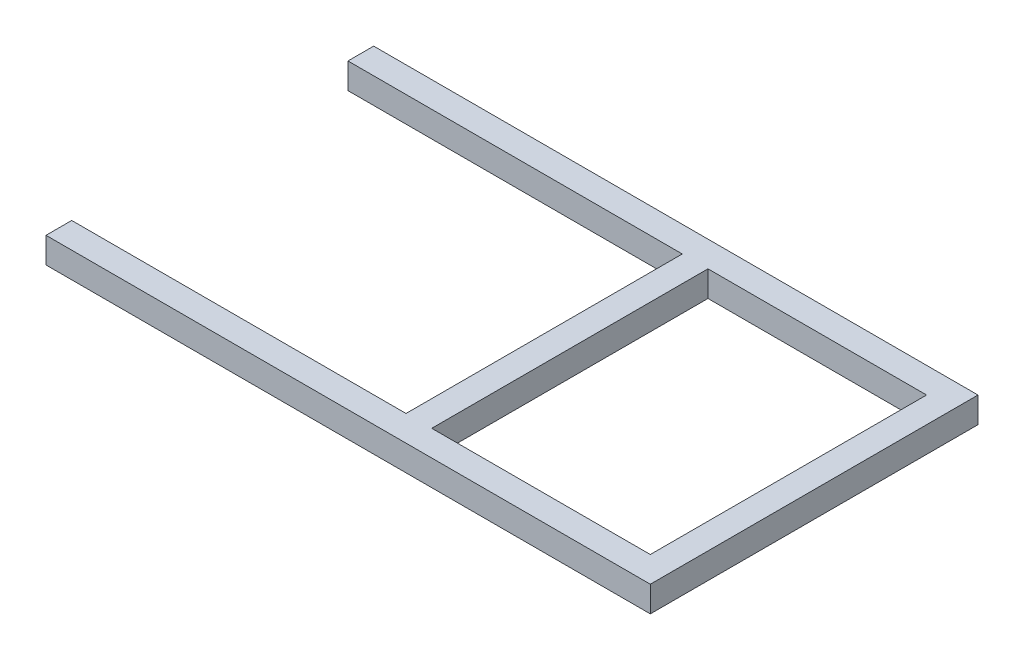
ISO-10303-21;
HEADER;
FILE_DESCRIPTION(('STEP AP214'),'2;1');
FILE_NAME('part.step','',(''),(''),'','','');
FILE_SCHEMA(('AUTOMOTIVE_DESIGN { 1 0 10303 214 1 1 1 1 }'));
ENDSEC;
DATA;
#1=APPLICATION_CONTEXT('core data for automotive mechanical design processes');
#2=APPLICATION_PROTOCOL_DEFINITION('international standard','automotive_design',2000,#1);
#3=PRODUCT_CONTEXT('',#1,'mechanical');
#4=PRODUCT('Part','Part','',(#3));
#5=PRODUCT_RELATED_PRODUCT_CATEGORY('part','',(#4));
#6=PRODUCT_DEFINITION_FORMATION('','',#4);
#7=PRODUCT_DEFINITION_CONTEXT('part definition',#1,'design');
#8=PRODUCT_DEFINITION('design','',#6,#7);
#9=PRODUCT_DEFINITION_SHAPE('','',#8);
#10=(LENGTH_UNIT() NAMED_UNIT(*) SI_UNIT(.MILLI.,.METRE.));
#11=(NAMED_UNIT(*) PLANE_ANGLE_UNIT() SI_UNIT($,.RADIAN.));
#12=(NAMED_UNIT(*) SI_UNIT($,.STERADIAN.) SOLID_ANGLE_UNIT());
#13=UNCERTAINTY_MEASURE_WITH_UNIT(LENGTH_MEASURE(1.E-05),#10,'distance_accuracy_value','');
#14=(GEOMETRIC_REPRESENTATION_CONTEXT(3) GLOBAL_UNCERTAINTY_ASSIGNED_CONTEXT((#13)) GLOBAL_UNIT_ASSIGNED_CONTEXT((#10,
#11,#12)) REPRESENTATION_CONTEXT('',''));
#15=CARTESIAN_POINT('',(0.,0.,0.));
#16=DIRECTION('',(0.,0.,1.));
#17=DIRECTION('',(1.,0.,0.));
#18=AXIS2_PLACEMENT_3D('',#15,#16,#17);
#19=CARTESIAN_POINT('',(-460.,20.,107.425));
#20=DIRECTION('',(0.,0.,1.));
#21=DIRECTION('',(1.,0.,0.));
#22=AXIS2_PLACEMENT_3D('',#19,#20,#21);
#23=PLANE('',#22);
#24=DIRECTION('',(0.,-1.,0.));
#25=VECTOR('',#24,1.);
#26=CARTESIAN_POINT('',(-200.,20.,107.425));
#27=LINE('',#26,#25);
#28=CARTESIAN_POINT('',(-200.,20.,107.425));
#29=VERTEX_POINT('',#28);
#30=CARTESIAN_POINT('',(-200.,0.,107.425));
#31=VERTEX_POINT('',#30);
#32=EDGE_CURVE('E138',#29,#31,#27,.T.);
#33=ORIENTED_EDGE('',*,*,#32,.T.);
#34=DIRECTION('',(1.,0.,0.));
#35=VECTOR('',#34,1.);
#36=CARTESIAN_POINT('',(-460.,0.,107.425));
#37=LINE('',#36,#35);
#38=CARTESIAN_POINT('',(-460.,0.,107.425));
#39=VERTEX_POINT('',#38);
#40=EDGE_CURVE('E131',#39,#31,#37,.T.);
#41=ORIENTED_EDGE('',*,*,#40,.F.);
#42=DIRECTION('',(0.,-1.,0.));
#43=VECTOR('',#42,1.);
#44=CARTESIAN_POINT('',(-460.,20.,107.425));
#45=LINE('',#44,#43);
#46=CARTESIAN_POINT('',(-460.,20.,107.425));
#47=VERTEX_POINT('',#46);
#48=EDGE_CURVE('E179',#47,#39,#45,.T.);
#49=ORIENTED_EDGE('',*,*,#48,.F.);
#50=DIRECTION('',(1.,0.,0.));
#51=VECTOR('',#50,1.);
#52=CARTESIAN_POINT('',(-460.,20.,107.425));
#53=LINE('',#52,#51);
#54=EDGE_CURVE('E48',#47,#29,#53,.T.);
#55=ORIENTED_EDGE('',*,*,#54,.T.);
#56=EDGE_LOOP('',(#33,#41,#49,#55));
#57=FACE_BOUND('',#56,.T.);
#58=ADVANCED_FACE('F33',(#57),#23,.F.);
#59=DIRECTION('',(0.,1.,0.));
#60=VECTOR('',#59,1.);
#61=CARTESIAN_POINT('',(-180.,20.,107.425));
#62=LINE('',#61,#60);
#63=CARTESIAN_POINT('',(-180.,0.,107.425));
#64=VERTEX_POINT('',#63);
#65=CARTESIAN_POINT('',(-180.,20.,107.425));
#66=VERTEX_POINT('',#65);
#67=EDGE_CURVE('E134',#64,#66,#62,.T.);
#68=ORIENTED_EDGE('',*,*,#67,.T.);
#69=CARTESIAN_POINT('',(-9.99999999999999,20.,107.425));
#70=VERTEX_POINT('',#69);
#71=EDGE_CURVE('E123',#66,#70,#53,.T.);
#72=ORIENTED_EDGE('',*,*,#71,.T.);
#73=DIRECTION('',(0.,-1.,0.));
#74=VECTOR('',#73,1.);
#75=CARTESIAN_POINT('',(-9.99999999999999,20.,107.425));
#76=LINE('',#75,#74);
#77=CARTESIAN_POINT('',(-9.99999999999999,0.,107.425));
#78=VERTEX_POINT('',#77);
#79=EDGE_CURVE('E173',#70,#78,#76,.T.);
#80=ORIENTED_EDGE('',*,*,#79,.T.);
#81=EDGE_CURVE('E56',#64,#78,#37,.T.);
#82=ORIENTED_EDGE('',*,*,#81,.F.);
#83=EDGE_LOOP('',(#68,#72,#80,#82));
#84=FACE_BOUND('',#83,.T.);
#85=ADVANCED_FACE('F135',(#84),#23,.F.);
#86=CARTESIAN_POINT('',(-460.,0.,-107.425));
#87=DIRECTION('',(0.,0.,-1.));
#88=DIRECTION('',(-1.,0.,0.));
#89=AXIS2_PLACEMENT_3D('',#86,#87,#88);
#90=PLANE('',#89);
#91=DIRECTION('',(0.,-1.,0.));
#92=VECTOR('',#91,1.);
#93=CARTESIAN_POINT('',(-200.,20.,-107.425));
#94=LINE('',#93,#92);
#95=CARTESIAN_POINT('',(-200.,20.,-107.425));
#96=VERTEX_POINT('',#95);
#97=CARTESIAN_POINT('',(-200.,0.,-107.425));
#98=VERTEX_POINT('',#97);
#99=EDGE_CURVE('E233',#96,#98,#94,.T.);
#100=ORIENTED_EDGE('',*,*,#99,.F.);
#101=DIRECTION('',(1.,0.,0.));
#102=VECTOR('',#101,1.);
#103=CARTESIAN_POINT('',(-460.,20.,-107.425));
#104=LINE('',#103,#102);
#105=CARTESIAN_POINT('',(-460.,20.,-107.425));
#106=VERTEX_POINT('',#105);
#107=EDGE_CURVE('E166',#106,#96,#104,.T.);
#108=ORIENTED_EDGE('',*,*,#107,.F.);
#109=DIRECTION('',(0.,1.,0.));
#110=VECTOR('',#109,1.);
#111=CARTESIAN_POINT('',(-460.,0.,-107.425));
#112=LINE('',#111,#110);
#113=CARTESIAN_POINT('',(-460.,0.,-107.425));
#114=VERTEX_POINT('',#113);
#115=EDGE_CURVE('E158',#114,#106,#112,.T.);
#116=ORIENTED_EDGE('',*,*,#115,.F.);
#117=DIRECTION('',(1.,0.,0.));
#118=VECTOR('',#117,1.);
#119=CARTESIAN_POINT('',(-460.,0.,-107.425));
#120=LINE('',#119,#118);
#121=EDGE_CURVE('E170',#114,#98,#120,.T.);
#122=ORIENTED_EDGE('',*,*,#121,.T.);
#123=EDGE_LOOP('',(#100,#108,#116,#122));
#124=FACE_BOUND('',#123,.T.);
#125=ADVANCED_FACE('F238',(#124),#90,.F.);
#126=DIRECTION('',(0.,1.,0.));
#127=VECTOR('',#126,1.);
#128=CARTESIAN_POINT('',(-180.,20.,-107.425));
#129=LINE('',#128,#127);
#130=CARTESIAN_POINT('',(-180.,0.,-107.425));
#131=VERTEX_POINT('',#130);
#132=CARTESIAN_POINT('',(-180.,20.,-107.425));
#133=VERTEX_POINT('',#132);
#134=EDGE_CURVE('E142',#131,#133,#129,.T.);
#135=ORIENTED_EDGE('',*,*,#134,.F.);
#136=CARTESIAN_POINT('',(-10.,0.,-107.425));
#137=VERTEX_POINT('',#136);
#138=EDGE_CURVE('E169',#131,#137,#120,.T.);
#139=ORIENTED_EDGE('',*,*,#138,.T.);
#140=DIRECTION('',(0.,1.,0.));
#141=VECTOR('',#140,1.);
#142=CARTESIAN_POINT('',(-10.,0.,-107.425));
#143=LINE('',#142,#141);
#144=CARTESIAN_POINT('',(-10.,20.,-107.425));
#145=VERTEX_POINT('',#144);
#146=EDGE_CURVE('E152',#137,#145,#143,.T.);
#147=ORIENTED_EDGE('',*,*,#146,.T.);
#148=EDGE_CURVE('E163',#133,#145,#104,.T.);
#149=ORIENTED_EDGE('',*,*,#148,.F.);
#150=EDGE_LOOP('',(#135,#139,#147,#149));
#151=FACE_BOUND('',#150,.T.);
#152=ADVANCED_FACE('F259',(#151),#90,.F.);
#153=CARTESIAN_POINT('',(-10.,20.,-127.425));
#154=DIRECTION('',(1.,0.,0.));
#155=DIRECTION('',(0.,0.,-1.));
#156=AXIS2_PLACEMENT_3D('',#153,#154,#155);
#157=PLANE('',#156);
#158=ORIENTED_EDGE('',*,*,#146,.F.);
#159=DIRECTION('',(0.,0.,1.));
#160=VECTOR('',#159,1.);
#161=CARTESIAN_POINT('',(-10.,0.,-127.425));
#162=LINE('',#161,#160);
#163=EDGE_CURVE('E201',#137,#78,#162,.T.);
#164=ORIENTED_EDGE('',*,*,#163,.T.);
#165=ORIENTED_EDGE('',*,*,#79,.F.);
#166=DIRECTION('',(0.,0.,1.));
#167=VECTOR('',#166,1.);
#168=CARTESIAN_POINT('',(-10.,20.,-127.425));
#169=LINE('',#168,#167);
#170=EDGE_CURVE('E129',#145,#70,#169,.T.);
#171=ORIENTED_EDGE('',*,*,#170,.F.);
#172=EDGE_LOOP('',(#158,#164,#165,#171));
#173=FACE_BOUND('',#172,.T.);
#174=ADVANCED_FACE('F257',(#173),#157,.F.);
#175=CARTESIAN_POINT('',(9.99999999999998,20.,-127.425));
#176=DIRECTION('',(-1.,0.,0.));
#177=DIRECTION('',(0.,0.,1.));
#178=AXIS2_PLACEMENT_3D('',#175,#176,#177);
#179=PLANE('',#178);
#180=DIRECTION('',(0.,0.,-1.));
#181=VECTOR('',#180,1.);
#182=CARTESIAN_POINT('',(9.99999999999998,0.,-127.425));
#183=LINE('',#182,#181);
#184=CARTESIAN_POINT('',(10.,0.,127.425));
#185=VERTEX_POINT('',#184);
#186=CARTESIAN_POINT('',(9.99999999999998,0.,-127.425));
#187=VERTEX_POINT('',#186);
#188=EDGE_CURVE('E187',#185,#187,#183,.T.);
#189=ORIENTED_EDGE('',*,*,#188,.T.);
#190=DIRECTION('',(0.,-1.,0.));
#191=VECTOR('',#190,1.);
#192=CARTESIAN_POINT('',(9.99999999999998,20.,-127.425));
#193=LINE('',#192,#191);
#194=CARTESIAN_POINT('',(9.99999999999998,20.,-127.425));
#195=VERTEX_POINT('',#194);
#196=EDGE_CURVE('E11',#195,#187,#193,.T.);
#197=ORIENTED_EDGE('',*,*,#196,.F.);
#198=DIRECTION('',(0.,0.,-1.));
#199=VECTOR('',#198,1.);
#200=CARTESIAN_POINT('',(9.99999999999998,20.,-127.425));
#201=LINE('',#200,#199);
#202=CARTESIAN_POINT('',(10.,20.,127.425));
#203=VERTEX_POINT('',#202);
#204=EDGE_CURVE('E188',#203,#195,#201,.T.);
#205=ORIENTED_EDGE('',*,*,#204,.F.);
#206=DIRECTION('',(0.,-1.,0.));
#207=VECTOR('',#206,1.);
#208=CARTESIAN_POINT('',(10.,20.,127.425));
#209=LINE('',#208,#207);
#210=EDGE_CURVE('E41',#203,#185,#209,.T.);
#211=ORIENTED_EDGE('',*,*,#210,.T.);
#212=EDGE_LOOP('',(#189,#197,#205,#211));
#213=FACE_BOUND('',#212,.T.);
#214=ADVANCED_FACE('F35',(#213),#179,.F.);
#215=CARTESIAN_POINT('',(-10.,20.,-127.425));
#216=DIRECTION('',(0.,0.,1.));
#217=DIRECTION('',(1.,0.,0.));
#218=AXIS2_PLACEMENT_3D('',#215,#216,#217);
#219=PLANE('',#218);
#220=DIRECTION('',(-1.,0.,0.));
#221=VECTOR('',#220,1.);
#222=CARTESIAN_POINT('',(-10.,0.,-127.425));
#223=LINE('',#222,#221);
#224=CARTESIAN_POINT('',(-460.,0.,-127.425));
#225=VERTEX_POINT('',#224);
#226=EDGE_CURVE('E199',#187,#225,#223,.T.);
#227=ORIENTED_EDGE('',*,*,#226,.T.);
#228=DIRECTION('',(0.,-1.,0.));
#229=VECTOR('',#228,1.);
#230=CARTESIAN_POINT('',(-460.,0.,-127.425));
#231=LINE('',#230,#229);
#232=CARTESIAN_POINT('',(-460.,20.,-127.425));
#233=VERTEX_POINT('',#232);
#234=EDGE_CURVE('E153',#233,#225,#231,.T.);
#235=ORIENTED_EDGE('',*,*,#234,.F.);
#236=DIRECTION('',(-1.,0.,0.));
#237=VECTOR('',#236,1.);
#238=CARTESIAN_POINT('',(-10.,20.,-127.425));
#239=LINE('',#238,#237);
#240=EDGE_CURVE('E191',#195,#233,#239,.T.);
#241=ORIENTED_EDGE('',*,*,#240,.F.);
#242=ORIENTED_EDGE('',*,*,#196,.T.);
#243=EDGE_LOOP('',(#227,#235,#241,#242));
#244=FACE_BOUND('',#243,.T.);
#245=ADVANCED_FACE('F218',(#244),#219,.F.);
#246=CARTESIAN_POINT('',(-9.99999999999999,20.,127.425));
#247=DIRECTION('',(0.,0.,-1.));
#248=DIRECTION('',(-1.,0.,0.));
#249=AXIS2_PLACEMENT_3D('',#246,#247,#248);
#250=PLANE('',#249);
#251=DIRECTION('',(1.,0.,0.));
#252=VECTOR('',#251,1.);
#253=CARTESIAN_POINT('',(-9.99999999999999,0.,127.425));
#254=LINE('',#253,#252);
#255=CARTESIAN_POINT('',(-460.,0.,127.425));
#256=VERTEX_POINT('',#255);
#257=EDGE_CURVE('E192',#256,#185,#254,.T.);
#258=ORIENTED_EDGE('',*,*,#257,.T.);
#259=ORIENTED_EDGE('',*,*,#210,.F.);
#260=DIRECTION('',(1.,0.,0.));
#261=VECTOR('',#260,1.);
#262=CARTESIAN_POINT('',(-9.99999999999999,20.,127.425));
#263=LINE('',#262,#261);
#264=CARTESIAN_POINT('',(-460.,20.,127.425));
#265=VERTEX_POINT('',#264);
#266=EDGE_CURVE('E195',#265,#203,#263,.T.);
#267=ORIENTED_EDGE('',*,*,#266,.F.);
#268=DIRECTION('',(0.,1.,0.));
#269=VECTOR('',#268,1.);
#270=CARTESIAN_POINT('',(-460.,20.,127.425));
#271=LINE('',#270,#269);
#272=EDGE_CURVE('E174',#256,#265,#271,.T.);
#273=ORIENTED_EDGE('',*,*,#272,.F.);
#274=EDGE_LOOP('',(#258,#259,#267,#273));
#275=FACE_BOUND('',#274,.T.);
#276=ADVANCED_FACE('F223',(#275),#250,.F.);
#277=CARTESIAN_POINT('',(0.,20.,0.));
#278=DIRECTION('',(0.,1.,0.));
#279=DIRECTION('',(0.,0.,1.));
#280=AXIS2_PLACEMENT_3D('',#277,#278,#279);
#281=PLANE('',#280);
#282=DIRECTION('',(0.,0.,-1.));
#283=VECTOR('',#282,1.);
#284=CARTESIAN_POINT('',(-200.,20.,107.425));
#285=LINE('',#284,#283);
#286=EDGE_CURVE('E137',#29,#96,#285,.T.);
#287=ORIENTED_EDGE('',*,*,#286,.F.);
#288=ORIENTED_EDGE('',*,*,#54,.F.);
#289=DIRECTION('',(0.,0.,-1.));
#290=VECTOR('',#289,1.);
#291=CARTESIAN_POINT('',(-460.,20.,127.425));
#292=LINE('',#291,#290);
#293=EDGE_CURVE('E177',#265,#47,#292,.T.);
#294=ORIENTED_EDGE('',*,*,#293,.F.);
#295=ORIENTED_EDGE('',*,*,#266,.T.);
#296=ORIENTED_EDGE('',*,*,#204,.T.);
#297=ORIENTED_EDGE('',*,*,#240,.T.);
#298=DIRECTION('',(0.,0.,-1.));
#299=VECTOR('',#298,1.);
#300=CARTESIAN_POINT('',(-460.,20.,-127.425));
#301=LINE('',#300,#299);
#302=EDGE_CURVE('E160',#106,#233,#301,.T.);
#303=ORIENTED_EDGE('',*,*,#302,.F.);
#304=ORIENTED_EDGE('',*,*,#107,.T.);
#305=EDGE_LOOP('',(#287,#288,#294,#295,#296,#297,#303,#304));
#306=FACE_BOUND('',#305,.T.);
#307=ORIENTED_EDGE('',*,*,#71,.F.);
#308=DIRECTION('',(0.,0.,-1.));
#309=VECTOR('',#308,1.);
#310=CARTESIAN_POINT('',(-180.,20.,107.425));
#311=LINE('',#310,#309);
#312=EDGE_CURVE('E126',#66,#133,#311,.T.);
#313=ORIENTED_EDGE('',*,*,#312,.T.);
#314=ORIENTED_EDGE('',*,*,#148,.T.);
#315=ORIENTED_EDGE('',*,*,#170,.T.);
#316=EDGE_LOOP('',(#307,#313,#314,#315));
#317=FACE_BOUND('',#316,.T.);
#318=ADVANCED_FACE('F124',(#306,#317),#281,.T.);
#319=CARTESIAN_POINT('',(0.,0.,0.));
#320=DIRECTION('',(0.,1.,0.));
#321=DIRECTION('',(0.,0.,1.));
#322=AXIS2_PLACEMENT_3D('',#319,#320,#321);
#323=PLANE('',#322);
#324=DIRECTION('',(0.,0.,-1.));
#325=VECTOR('',#324,1.);
#326=CARTESIAN_POINT('',(-180.,0.,107.425));
#327=LINE('',#326,#325);
#328=EDGE_CURVE('E144',#64,#131,#327,.T.);
#329=ORIENTED_EDGE('',*,*,#328,.F.);
#330=ORIENTED_EDGE('',*,*,#81,.T.);
#331=ORIENTED_EDGE('',*,*,#163,.F.);
#332=ORIENTED_EDGE('',*,*,#138,.F.);
#333=EDGE_LOOP('',(#329,#330,#331,#332));
#334=FACE_BOUND('',#333,.T.);
#335=ORIENTED_EDGE('',*,*,#188,.F.);
#336=ORIENTED_EDGE('',*,*,#257,.F.);
#337=DIRECTION('',(0.,0.,1.));
#338=VECTOR('',#337,1.);
#339=CARTESIAN_POINT('',(-460.,0.,127.425));
#340=LINE('',#339,#338);
#341=EDGE_CURVE('E181',#39,#256,#340,.T.);
#342=ORIENTED_EDGE('',*,*,#341,.F.);
#343=ORIENTED_EDGE('',*,*,#40,.T.);
#344=DIRECTION('',(0.,0.,-1.));
#345=VECTOR('',#344,1.);
#346=CARTESIAN_POINT('',(-200.,0.,107.425));
#347=LINE('',#346,#345);
#348=EDGE_CURVE('E146',#31,#98,#347,.T.);
#349=ORIENTED_EDGE('',*,*,#348,.T.);
#350=ORIENTED_EDGE('',*,*,#121,.F.);
#351=DIRECTION('',(0.,0.,1.));
#352=VECTOR('',#351,1.);
#353=CARTESIAN_POINT('',(-460.,0.,-127.425));
#354=LINE('',#353,#352);
#355=EDGE_CURVE('E156',#225,#114,#354,.T.);
#356=ORIENTED_EDGE('',*,*,#355,.F.);
#357=ORIENTED_EDGE('',*,*,#226,.F.);
#358=EDGE_LOOP('',(#335,#336,#342,#343,#349,#350,#356,#357));
#359=FACE_BOUND('',#358,.T.);
#360=ADVANCED_FACE('F212',(#334,#359),#323,.F.);
#361=CARTESIAN_POINT('',(-460.,0.,0.));
#362=DIRECTION('',(1.,0.,0.));
#363=DIRECTION('',(0.,0.,-1.));
#364=AXIS2_PLACEMENT_3D('',#361,#362,#363);
#365=PLANE('',#364);
#366=ORIENTED_EDGE('',*,*,#272,.T.);
#367=ORIENTED_EDGE('',*,*,#293,.T.);
#368=ORIENTED_EDGE('',*,*,#48,.T.);
#369=ORIENTED_EDGE('',*,*,#341,.T.);
#370=EDGE_LOOP('',(#366,#367,#368,#369));
#371=FACE_BOUND('',#370,.T.);
#372=ADVANCED_FACE('F225',(#371),#365,.F.);
#373=CARTESIAN_POINT('',(-460.,0.,0.));
#374=DIRECTION('',(1.,0.,0.));
#375=DIRECTION('',(0.,0.,-1.));
#376=AXIS2_PLACEMENT_3D('',#373,#374,#375);
#377=PLANE('',#376);
#378=ORIENTED_EDGE('',*,*,#234,.T.);
#379=ORIENTED_EDGE('',*,*,#355,.T.);
#380=ORIENTED_EDGE('',*,*,#115,.T.);
#381=ORIENTED_EDGE('',*,*,#302,.T.);
#382=EDGE_LOOP('',(#378,#379,#380,#381));
#383=FACE_BOUND('',#382,.T.);
#384=ADVANCED_FACE('F240',(#383),#377,.F.);
#385=CARTESIAN_POINT('',(-200.,20.,107.425));
#386=DIRECTION('',(1.,0.,0.));
#387=DIRECTION('',(0.,0.,-1.));
#388=AXIS2_PLACEMENT_3D('',#385,#386,#387);
#389=PLANE('',#388);
#390=ORIENTED_EDGE('',*,*,#99,.T.);
#391=ORIENTED_EDGE('',*,*,#348,.F.);
#392=ORIENTED_EDGE('',*,*,#32,.F.);
#393=ORIENTED_EDGE('',*,*,#286,.T.);
#394=EDGE_LOOP('',(#390,#391,#392,#393));
#395=FACE_BOUND('',#394,.T.);
#396=ADVANCED_FACE('F231',(#395),#389,.F.);
#397=CARTESIAN_POINT('',(-180.,20.,107.425));
#398=DIRECTION('',(-1.,0.,0.));
#399=DIRECTION('',(0.,0.,1.));
#400=AXIS2_PLACEMENT_3D('',#397,#398,#399);
#401=PLANE('',#400);
#402=ORIENTED_EDGE('',*,*,#134,.T.);
#403=ORIENTED_EDGE('',*,*,#312,.F.);
#404=ORIENTED_EDGE('',*,*,#67,.F.);
#405=ORIENTED_EDGE('',*,*,#328,.T.);
#406=EDGE_LOOP('',(#402,#403,#404,#405));
#407=FACE_BOUND('',#406,.T.);
#408=ADVANCED_FACE('F140',(#407),#401,.F.);
#409=CLOSED_SHELL('',(#58,#85,#125,#152,#174,#214,#245,#276,#318,#360,#372,#384,#396,#408));
#410=MANIFOLD_SOLID_BREP('B2',#409);
#411=ADVANCED_BREP_SHAPE_REPRESENTATION('',(#18,#410),#14);
#412=SHAPE_DEFINITION_REPRESENTATION(#9,#411);
ENDSEC;
END-ISO-10303-21;
